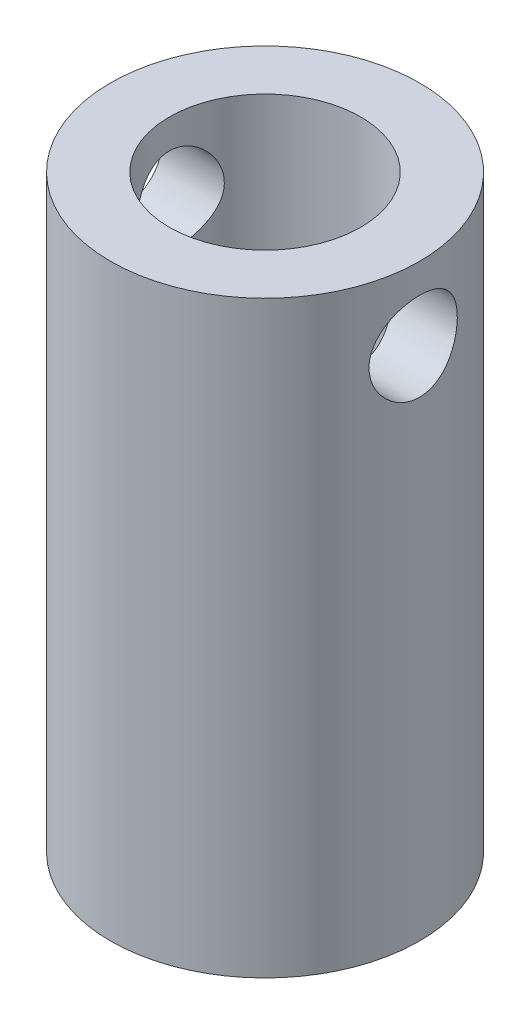
ISO-10303-21;
HEADER;
FILE_DESCRIPTION(('STEP AP214'),'2;1');
FILE_NAME('part.step','',(''),(''),'','','');
FILE_SCHEMA(('AUTOMOTIVE_DESIGN { 1 0 10303 214 1 1 1 1 }'));
ENDSEC;
DATA;
#1=APPLICATION_CONTEXT('core data for automotive mechanical design processes');
#2=APPLICATION_PROTOCOL_DEFINITION('international standard','automotive_design',2000,#1);
#3=PRODUCT_CONTEXT('',#1,'mechanical');
#4=PRODUCT('Part','Part','',(#3));
#5=PRODUCT_RELATED_PRODUCT_CATEGORY('part','',(#4));
#6=PRODUCT_DEFINITION_FORMATION('','',#4);
#7=PRODUCT_DEFINITION_CONTEXT('part definition',#1,'design');
#8=PRODUCT_DEFINITION('design','',#6,#7);
#9=PRODUCT_DEFINITION_SHAPE('','',#8);
#10=(LENGTH_UNIT() NAMED_UNIT(*) SI_UNIT(.MILLI.,.METRE.));
#11=(NAMED_UNIT(*) PLANE_ANGLE_UNIT() SI_UNIT($,.RADIAN.));
#12=(NAMED_UNIT(*) SI_UNIT($,.STERADIAN.) SOLID_ANGLE_UNIT());
#13=UNCERTAINTY_MEASURE_WITH_UNIT(LENGTH_MEASURE(1.E-05),#10,'distance_accuracy_value','');
#14=(GEOMETRIC_REPRESENTATION_CONTEXT(3) GLOBAL_UNCERTAINTY_ASSIGNED_CONTEXT((#13)) GLOBAL_UNIT_ASSIGNED_CONTEXT((#10,
#11,#12)) REPRESENTATION_CONTEXT('',''));
#15=CARTESIAN_POINT('',(0.,0.,0.));
#16=DIRECTION('',(0.,0.,1.));
#17=DIRECTION('',(1.,0.,0.));
#18=AXIS2_PLACEMENT_3D('',#15,#16,#17);
#19=CARTESIAN_POINT('',(0.,20.,0.));
#20=DIRECTION('',(0.,-1.,0.));
#21=DIRECTION('',(0.,0.,-1.));
#22=AXIS2_PLACEMENT_3D('',#19,#20,#21);
#23=CYLINDRICAL_SURFACE('',#22,5.25);
#24=CARTESIAN_POINT('',(0.,20.,0.));
#25=DIRECTION('',(0.,1.,0.));
#26=DIRECTION('',(0.,0.,1.));
#27=AXIS2_PLACEMENT_3D('',#24,#25,#26);
#28=CIRCLE('',#27,5.25);
#29=CARTESIAN_POINT('',(0.,20.,5.25));
#30=VERTEX_POINT('',#29);
#31=EDGE_CURVE('E10',#30,#30,#28,.T.);
#32=ORIENTED_EDGE('',*,*,#31,.F.);
#33=EDGE_LOOP('',(#32));
#34=FACE_BOUND('',#33,.T.);
#35=CARTESIAN_POINT('',(0.,0.,0.));
#36=DIRECTION('',(0.,1.,0.));
#37=DIRECTION('',(0.,0.,1.));
#38=AXIS2_PLACEMENT_3D('',#35,#36,#37);
#39=CIRCLE('',#38,5.25);
#40=CARTESIAN_POINT('',(0.,0.,5.25));
#41=VERTEX_POINT('',#40);
#42=EDGE_CURVE('E55',#41,#41,#39,.T.);
#43=ORIENTED_EDGE('',*,*,#42,.T.);
#44=EDGE_LOOP('',(#43));
#45=FACE_BOUND('',#44,.T.);
#46=CARTESIAN_POINT('',(-5.03115294937453,17.5,1.5));
#47=CARTESIAN_POINT('',(-5.03115410257281,17.5823886534079,1.49999851534795));
#48=CARTESIAN_POINT('',(-5.03319884759406,17.6647923131909,1.49318899949663));
#49=CARTESIAN_POINT('',(-5.04112791905326,17.8272034291472,1.46619272542646));
#50=CARTESIAN_POINT('',(-5.04701380722367,17.9072098968255,1.44600052602251));
#51=CARTESIAN_POINT('',(-5.06190532141159,18.0624529006536,1.3929700746965));
#52=CARTESIAN_POINT('',(-5.07090611443027,18.1376966138629,1.36015140488906));
#53=CARTESIAN_POINT('',(-5.09100690822109,18.2816258586658,1.28286273047203));
#54=CARTESIAN_POINT('',(-5.10210715818895,18.3503106102835,1.2383913424976));
#55=CARTESIAN_POINT('',(-5.12551337410616,18.4811436739861,1.13769360073649));
#56=CARTESIAN_POINT('',(-5.13784316973113,18.5430758515969,1.08119190834937));
#57=CARTESIAN_POINT('',(-5.16211474134014,18.6567270874778,0.958628434101953));
#58=CARTESIAN_POINT('',(-5.17405647175239,18.7084449498421,0.892565534369725));
#59=CARTESIAN_POINT('',(-5.19647499001134,18.8011214862651,0.751234524118193));
#60=CARTESIAN_POINT('',(-5.2069204087565,18.8418622148132,0.675818087821401));
#61=CARTESIAN_POINT('',(-5.22489405364148,18.910001330812,0.51885635642973));
#62=CARTESIAN_POINT('',(-5.23242284768149,18.9374023159302,0.437312258156379));
#63=CARTESIAN_POINT('',(-5.24354639475177,18.9773758459298,0.272668931340882));
#64=CARTESIAN_POINT('',(-5.24723870258477,18.9903167662785,0.189665848596779));
#65=CARTESIAN_POINT('',(-5.2506157174477,19.0021650504124,0.0225900768164428));
#66=CARTESIAN_POINT('',(-5.25030119054237,19.001075096753,-0.0614824046914111));
#67=CARTESIAN_POINT('',(-5.2457700507248,18.9851452188115,-0.225735146801415));
#68=CARTESIAN_POINT('',(-5.24166653082038,18.9707037905215,-0.305957659581709));
#69=CARTESIAN_POINT('',(-5.23015414747603,18.9291286731517,-0.462789166633213));
#70=CARTESIAN_POINT('',(-5.22274508292168,18.9019942118034,-0.539397940725381));
#71=CARTESIAN_POINT('',(-5.20529273829083,18.8355179493911,-0.687805375296693));
#72=CARTESIAN_POINT('',(-5.195221541341,18.7960459166438,-0.75954228288808));
#73=CARTESIAN_POINT('',(-5.17352076730531,18.7061165602015,-0.895505432692864));
#74=CARTESIAN_POINT('',(-5.16189084893963,18.6556568292501,-0.959730024312008));
#75=CARTESIAN_POINT('',(-5.13784262264717,18.5430957170361,-1.08122448641081));
#76=CARTESIAN_POINT('',(-5.1254109702704,18.4806479247962,-1.13817118318867));
#77=CARTESIAN_POINT('',(-5.10152230340244,18.3469636811155,-1.24086976181232));
#78=CARTESIAN_POINT('',(-5.09006536804024,18.2757265172882,-1.28662073533696));
#79=CARTESIAN_POINT('',(-5.06936381110807,18.1257018366265,-1.36592501989086));
#80=CARTESIAN_POINT('',(-5.06013758203982,18.0468585812113,-1.39937803341578));
#81=CARTESIAN_POINT('',(-5.04516408290506,17.8843351273715,-1.45244213622067));
#82=CARTESIAN_POINT('',(-5.03941580065156,17.8006563440051,-1.47205725302032));
#83=CARTESIAN_POINT('',(-5.03226836397145,17.6338896817508,-1.49630562899914));
#84=CARTESIAN_POINT('',(-5.03072783487502,17.5508786373002,-1.50142611118016));
#85=CARTESIAN_POINT('',(-5.0317811969763,17.3851837630593,-1.49789247539749));
#86=CARTESIAN_POINT('',(-5.03437457244426,17.3024998937418,-1.48924007568482));
#87=CARTESIAN_POINT('',(-5.04326572540292,17.1417690789828,-1.45883836069446));
#88=CARTESIAN_POINT('',(-5.04947732224089,17.0636593104886,-1.43739346638105));
#89=CARTESIAN_POINT('',(-5.06481797948048,16.9121485960017,-1.38236371399822));
#90=CARTESIAN_POINT('',(-5.07394746083355,16.8387483312658,-1.34877710420076));
#91=CARTESIAN_POINT('',(-5.09437641007042,16.6967334435874,-1.26946473841217));
#92=CARTESIAN_POINT('',(-5.10572398035842,16.6282821668484,-1.22345918796848));
#93=CARTESIAN_POINT('',(-5.12920294912374,16.4998927199175,-1.12095347763631));
#94=CARTESIAN_POINT('',(-5.14133451710708,16.4399563997409,-1.06445104326103));
#95=CARTESIAN_POINT('',(-5.16551045577065,16.3282154362839,-0.940281007474169));
#96=CARTESIAN_POINT('',(-5.17753804534607,16.276753771436,-0.872300782680413));
#97=CARTESIAN_POINT('',(-5.19973482784499,16.185965738963,-0.72838898029316));
#98=CARTESIAN_POINT('',(-5.20990411789059,16.1466387370582,-0.652457818573639));
#99=CARTESIAN_POINT('',(-5.22717378634804,16.0816117847303,-0.495324954717126));
#100=CARTESIAN_POINT('',(-5.23429731095436,16.0558087078104,-0.414168599924728));
#101=CARTESIAN_POINT('',(-5.24477504717914,16.0182798985449,-0.248434236412444));
#102=CARTESIAN_POINT('',(-5.24813022842264,16.006550544864,-0.163857113689079));
#103=CARTESIAN_POINT('',(-5.25064001252463,15.9977564245017,0.00313367846927154));
#104=CARTESIAN_POINT('',(-5.24993777691747,16.0001918881879,0.0855192232874674));
#105=CARTESIAN_POINT('',(-5.24474301841601,16.0184787110577,0.248658879316503));
#106=CARTESIAN_POINT('',(-5.24025067702944,16.0343294277865,0.329413068463148));
#107=CARTESIAN_POINT('',(-5.22801601395087,16.0786985207341,0.486303099779689));
#108=CARTESIAN_POINT('',(-5.22030310536131,16.107102384208,0.562473775076286));
#109=CARTESIAN_POINT('',(-5.2024282060759,16.1756696187141,0.709010402071095));
#110=CARTESIAN_POINT('',(-5.19226583626338,16.2158348103192,0.77937545293551));
#111=CARTESIAN_POINT('',(-5.17019216580141,16.3081730030686,0.914575092265432));
#112=CARTESIAN_POINT('',(-5.15823784339672,16.3606675650913,0.979182996005303));
#113=CARTESIAN_POINT('',(-5.13408048739897,16.4755818440905,1.09884091673879));
#114=CARTESIAN_POINT('',(-5.12187738590337,16.5380043033136,1.15388828414235));
#115=CARTESIAN_POINT('',(-5.09823028157902,16.6729726877466,1.25430634521844));
#116=CARTESIAN_POINT('',(-5.08681463826367,16.7457414606276,1.29938487542695));
#117=CARTESIAN_POINT('',(-5.0664633399873,16.898141398986,1.37660957714714));
#118=CARTESIAN_POINT('',(-5.05752629789876,16.9777686933163,1.40876298663645));
#119=CARTESIAN_POINT('',(-5.04418844667444,17.1307402751745,1.4557390050935));
#120=CARTESIAN_POINT('',(-5.03934329125492,17.2035177610769,1.47229424986293));
#121=CARTESIAN_POINT('',(-5.03282527099894,17.3508595887639,1.49442455282771));
#122=CARTESIAN_POINT('',(-5.03115190552542,17.4254236466733,1.5000013438736));
#123=CARTESIAN_POINT('',(-5.03115294937453,17.5,1.5));
#124=B_SPLINE_CURVE_WITH_KNOTS('',3,(#46,#47,#48,#49,#50,#51,#52,#53,#54,#55,#56,#57,#58,#59,
#60,#61,#62,#63,#64,#65,#66,#67,#68,#69,#70,#71,#72,#73,#74,#75,#76,#77,#78,#79,#80,#81,#82,#83,
#84,#85,#86,#87,#88,#89,#90,#91,#92,#93,#94,#95,#96,#97,#98,#99,#100,#101,#102,#103,#104,#105,
#106,#107,#108,#109,#110,#111,#112,#113,#114,#115,#116,#117,#118,#119,#120,#121,#122,#123),
.UNSPECIFIED.,.T.,.F.,(4,2,2,2,2,2,2,2,2,2,2,2,2,2,2,2,2,2,2,2,2,2,2,2,2,2,2,2,2,2,2,2,2,2,2,2,
2,2,4),(0.,0.246891256772964,0.493882957214146,0.740493137802325,0.987132608255508,
1.24017875404962,1.49325450928862,1.75103612260385,2.00876751763279,2.25977175771556,
2.51072800914313,2.75442778232566,2.99814238459891,3.24452177533869,3.49095519888626,
3.7460370951975,4.0011396797232,4.25827890472504,4.51534325844758,4.7636577250011,
5.01194121523837,5.25453967242384,5.49717314412031,5.74581004531786,5.99450088465078,
6.25159041282492,6.50866650063485,6.76375263973567,7.01877312807479,7.26485173263045,
7.51091855317931,7.75478559291908,7.99869040157417,8.2498482655903,8.50107562436486,
8.7589020931598,9.01658397911738,9.2400996664987,9.46358007110251),.UNSPECIFIED.);
#125=CARTESIAN_POINT('',(-5.03115294937453,17.5,1.5));
#126=VERTEX_POINT('',#125);
#127=EDGE_CURVE('E85',#126,#126,#124,.T.);
#128=ORIENTED_EDGE('',*,*,#127,.F.);
#129=EDGE_LOOP('',(#128));
#130=FACE_BOUND('',#129,.T.);
#131=CARTESIAN_POINT('',(5.03115294937453,17.5,1.5));
#132=CARTESIAN_POINT('',(5.03115410257281,17.4176113465921,1.49999851534795));
#133=CARTESIAN_POINT('',(5.03319884759406,17.3352076868091,1.49318899949663));
#134=CARTESIAN_POINT('',(5.04112791905326,17.1727965708528,1.46619272542646));
#135=CARTESIAN_POINT('',(5.04701380722367,17.0927901031745,1.44600052602251));
#136=CARTESIAN_POINT('',(5.06190532141159,16.9375470993464,1.3929700746965));
#137=CARTESIAN_POINT('',(5.07090611443027,16.8623033861372,1.36015140488906));
#138=CARTESIAN_POINT('',(5.09100690822109,16.7183741413342,1.28286273047203));
#139=CARTESIAN_POINT('',(5.10210715818895,16.6496893897165,1.2383913424976));
#140=CARTESIAN_POINT('',(5.12551337410616,16.5188563260139,1.13769360073649));
#141=CARTESIAN_POINT('',(5.13784316973113,16.4569241484031,1.08119190834937));
#142=CARTESIAN_POINT('',(5.16211474134014,16.3432729125222,0.958628434101953));
#143=CARTESIAN_POINT('',(5.17405647175239,16.2915550501579,0.892565534369725));
#144=CARTESIAN_POINT('',(5.19647499001134,16.1988785137349,0.751234524118193));
#145=CARTESIAN_POINT('',(5.2069204087565,16.1581377851868,0.675818087821401));
#146=CARTESIAN_POINT('',(5.22489405364148,16.089998669188,0.51885635642973));
#147=CARTESIAN_POINT('',(5.23242284768149,16.0625976840698,0.437312258156379));
#148=CARTESIAN_POINT('',(5.24354639475177,16.0226241540702,0.272668931340882));
#149=CARTESIAN_POINT('',(5.24723870258477,16.0096832337215,0.189665848596779));
#150=CARTESIAN_POINT('',(5.2506157174477,15.9978349495876,0.0225900768164428));
#151=CARTESIAN_POINT('',(5.25030119054237,15.998924903247,-0.0614824046914111));
#152=CARTESIAN_POINT('',(5.2457700507248,16.0148547811885,-0.225735146801415));
#153=CARTESIAN_POINT('',(5.24166653082038,16.0292962094785,-0.30595765958171));
#154=CARTESIAN_POINT('',(5.23015414747603,16.0708713268483,-0.462789166633213));
#155=CARTESIAN_POINT('',(5.22274508292168,16.0980057881966,-0.539397940725381));
#156=CARTESIAN_POINT('',(5.20529273829083,16.1644820506089,-0.687805375296692));
#157=CARTESIAN_POINT('',(5.195221541341,16.2039540833563,-0.759542282888079));
#158=CARTESIAN_POINT('',(5.17352076730531,16.2938834397985,-0.895505432692863));
#159=CARTESIAN_POINT('',(5.16189084893963,16.3443431707499,-0.959730024312007));
#160=CARTESIAN_POINT('',(5.13784262264717,16.4569042829639,-1.08122448641081));
#161=CARTESIAN_POINT('',(5.1254109702704,16.5193520752038,-1.13817118318867));
#162=CARTESIAN_POINT('',(5.10152230340244,16.6530363188845,-1.24086976181232));
#163=CARTESIAN_POINT('',(5.09006536804024,16.7242734827118,-1.28662073533696));
#164=CARTESIAN_POINT('',(5.06936381110807,16.8742981633735,-1.36592501989086));
#165=CARTESIAN_POINT('',(5.06013758203982,16.9531414187887,-1.39937803341579));
#166=CARTESIAN_POINT('',(5.04516408290506,17.1156648726285,-1.45244213622067));
#167=CARTESIAN_POINT('',(5.03941580065156,17.1993436559949,-1.47205725302032));
#168=CARTESIAN_POINT('',(5.03226836397145,17.3661103182492,-1.49630562899914));
#169=CARTESIAN_POINT('',(5.03072783487502,17.4491213626998,-1.50142611118016));
#170=CARTESIAN_POINT('',(5.0317811969763,17.6148162369407,-1.49789247539749));
#171=CARTESIAN_POINT('',(5.03437457244426,17.6975001062582,-1.48924007568482));
#172=CARTESIAN_POINT('',(5.04326572540292,17.8582309210172,-1.45883836069446));
#173=CARTESIAN_POINT('',(5.04947732224088,17.9363406895114,-1.43739346638105));
#174=CARTESIAN_POINT('',(5.06481797948048,18.0878514039983,-1.38236371399822));
#175=CARTESIAN_POINT('',(5.07394746083355,18.1612516687342,-1.34877710420076));
#176=CARTESIAN_POINT('',(5.09437641007042,18.3032665564126,-1.26946473841218));
#177=CARTESIAN_POINT('',(5.10572398035841,18.3717178331516,-1.22345918796849));
#178=CARTESIAN_POINT('',(5.12920294912373,18.5001072800825,-1.12095347763631));
#179=CARTESIAN_POINT('',(5.14133451710708,18.5600436002591,-1.06445104326103));
#180=CARTESIAN_POINT('',(5.16551045577065,18.6717845637161,-0.940281007474169));
#181=CARTESIAN_POINT('',(5.17753804534607,18.7232462285641,-0.872300782680412));
#182=CARTESIAN_POINT('',(5.19973482784499,18.8140342610371,-0.72838898029316));
#183=CARTESIAN_POINT('',(5.20990411789059,18.8533612629418,-0.652457818573639));
#184=CARTESIAN_POINT('',(5.22717378634804,18.9183882152697,-0.495324954717126));
#185=CARTESIAN_POINT('',(5.23429731095436,18.9441912921896,-0.414168599924728));
#186=CARTESIAN_POINT('',(5.24477504717914,18.9817201014551,-0.248434236412444));
#187=CARTESIAN_POINT('',(5.24813022842264,18.993449455136,-0.163857113689079));
#188=CARTESIAN_POINT('',(5.25064001252463,19.0022435754983,0.00313367846927145));
#189=CARTESIAN_POINT('',(5.24993777691747,18.9998081118121,0.0855192232874671));
#190=CARTESIAN_POINT('',(5.24474301841601,18.9815212889423,0.248658879316502));
#191=CARTESIAN_POINT('',(5.24025067702944,18.9656705722135,0.329413068463148));
#192=CARTESIAN_POINT('',(5.22801601395087,18.9213014792659,0.486303099779689));
#193=CARTESIAN_POINT('',(5.22030310536131,18.892897615792,0.562473775076285));
#194=CARTESIAN_POINT('',(5.2024282060759,18.8243303812859,0.709010402071094));
#195=CARTESIAN_POINT('',(5.19226583626338,18.7841651896808,0.77937545293551));
#196=CARTESIAN_POINT('',(5.17019216580141,18.6918269969314,0.914575092265432));
#197=CARTESIAN_POINT('',(5.15823784339672,18.6393324349087,0.979182996005303));
#198=CARTESIAN_POINT('',(5.13408048739897,18.5244181559095,1.09884091673879));
#199=CARTESIAN_POINT('',(5.12187738590337,18.4619956966864,1.15388828414235));
#200=CARTESIAN_POINT('',(5.09823028157902,18.3270273122534,1.25430634521844));
#201=CARTESIAN_POINT('',(5.08681463826367,18.2542585393724,1.29938487542695));
#202=CARTESIAN_POINT('',(5.0664633399873,18.101858601014,1.37660957714714));
#203=CARTESIAN_POINT('',(5.05752629789876,18.0222313066838,1.40876298663645));
#204=CARTESIAN_POINT('',(5.04418844667444,17.8692597248255,1.4557390050935));
#205=CARTESIAN_POINT('',(5.03934329125492,17.7964822389231,1.47229424986293));
#206=CARTESIAN_POINT('',(5.03282527099894,17.6491404112361,1.49442455282771));
#207=CARTESIAN_POINT('',(5.03115190552542,17.5745763533267,1.5000013438736));
#208=CARTESIAN_POINT('',(5.03115294937453,17.5,1.5));
#209=B_SPLINE_CURVE_WITH_KNOTS('',3,(#131,#132,#133,#134,#135,#136,#137,#138,#139,#140,#141,
#142,#143,#144,#145,#146,#147,#148,#149,#150,#151,#152,#153,#154,#155,#156,#157,#158,#159,#160,
#161,#162,#163,#164,#165,#166,#167,#168,#169,#170,#171,#172,#173,#174,#175,#176,#177,#178,#179,
#180,#181,#182,#183,#184,#185,#186,#187,#188,#189,#190,#191,#192,#193,#194,#195,#196,#197,#198,
#199,#200,#201,#202,#203,#204,#205,#206,#207,#208),.UNSPECIFIED.,.T.,.F.,(4,2,2,2,2,2,2,2,2,2,2,
2,2,2,2,2,2,2,2,2,2,2,2,2,2,2,2,2,2,2,2,2,2,2,2,2,2,2,4),(0.,0.246891256772964,
0.493882957214146,0.740493137802325,0.987132608255508,1.24017875404962,1.49325450928862,
1.75103612260385,2.00876751763279,2.25977175771556,2.51072800914313,2.75442778232566,
2.99814238459891,3.24452177533868,3.49095519888626,3.7460370951975,4.0011396797232,
4.25827890472505,4.51534325844759,4.7636577250011,5.01194121523837,5.25453967242383,
5.49717314412031,5.74581004531786,5.99450088465079,6.25159041282492,6.50866650063485,
6.76375263973567,7.01877312807479,7.26485173263045,7.51091855317931,7.75478559291908,
7.99869040157417,8.2498482655903,8.50107562436486,8.7589020931598,9.01658397911738,
9.2400996664987,9.46358007110251),.UNSPECIFIED.);
#210=CARTESIAN_POINT('',(5.03115294937453,17.5,1.5));
#211=VERTEX_POINT('',#210);
#212=EDGE_CURVE('E91',#211,#211,#209,.T.);
#213=ORIENTED_EDGE('',*,*,#212,.F.);
#214=EDGE_LOOP('',(#213));
#215=FACE_BOUND('',#214,.T.);
#216=ADVANCED_FACE('F41',(#34,#45,#130,#215),#23,.T.);
#217=CARTESIAN_POINT('',(0.,20.,0.));
#218=DIRECTION('',(0.,-1.,0.));
#219=DIRECTION('',(0.,0.,-1.));
#220=AXIS2_PLACEMENT_3D('',#217,#218,#219);
#221=CYLINDRICAL_SURFACE('',#220,3.25);
#222=CARTESIAN_POINT('',(-2.8831406486677,17.5,1.5));
#223=CARTESIAN_POINT('',(-2.8831457136264,17.5790560976274,1.49999556641992));
#224=CARTESIAN_POINT('',(-2.88644015844544,17.6582321126341,1.49370969693478));
#225=CARTESIAN_POINT('',(-2.89916399453696,17.8142248528964,1.46885414761836));
#226=CARTESIAN_POINT('',(-2.90860817570421,17.8910354217358,1.45025485263671));
#227=CARTESIAN_POINT('',(-2.9323139633626,18.0397553643252,1.40169687369929));
#228=CARTESIAN_POINT('',(-2.94655285334821,18.1116859627269,1.37179167466406));
#229=CARTESIAN_POINT('',(-2.9782090887604,18.2494914891467,1.30163233654912));
#230=CARTESIAN_POINT('',(-2.99562617608213,18.3153669082597,1.26137903774134));
#231=CARTESIAN_POINT('',(-3.03316714708755,18.4442826866733,1.16836618134815));
#232=CARTESIAN_POINT('',(-3.0533950906629,18.5068049831577,1.11493024482922));
#233=CARTESIAN_POINT('',(-3.09343234273965,18.6223938096352,0.998482280785272));
#234=CARTESIAN_POINT('',(-3.11324146363631,18.6754561781191,0.935466061279191));
#235=CARTESIAN_POINT('',(-3.15152392195906,18.7734806432329,0.797372263715595));
#236=CARTESIAN_POINT('',(-3.16986256926451,18.8178315620688,0.721820051078077));
#237=CARTESIAN_POINT('',(-3.20182516260171,18.8929625183494,0.56332409092034));
#238=CARTESIAN_POINT('',(-3.21545165364737,18.9237498838764,0.480384363900044));
#239=CARTESIAN_POINT('',(-3.23571086174561,18.9689131696823,0.314933648113405));
#240=CARTESIAN_POINT('',(-3.24272563710553,18.9841902107523,0.232716432643605));
#241=CARTESIAN_POINT('',(-3.25037878818967,19.0008399521561,0.0666076979909081));
#242=CARTESIAN_POINT('',(-3.25102038740195,19.0022196816145,-0.0172829532677168));
#243=CARTESIAN_POINT('',(-3.2460575180355,18.9914440101853,-0.177691624209255));
#244=CARTESIAN_POINT('',(-3.24091400620298,18.9802875539496,-0.254293968157488));
#245=CARTESIAN_POINT('',(-3.22562512287074,18.946507332497,-0.404395406998727));
#246=CARTESIAN_POINT('',(-3.21547938016454,18.9238827162453,-0.477894271148611));
#247=CARTESIAN_POINT('',(-3.19094774192041,18.8675879627256,-0.621056530120167));
#248=CARTESIAN_POINT('',(-3.17650045920505,18.8337570549195,-0.69064575176384));
#249=CARTESIAN_POINT('',(-3.14472149367112,18.7561940983343,-0.823340056563827));
#250=CARTESIAN_POINT('',(-3.12738875365795,18.7124584184491,-0.88644274938207));
#251=CARTESIAN_POINT('',(-3.08981116071687,18.6121036124907,-1.00998865129199));
#252=CARTESIAN_POINT('',(-3.06944399350116,18.554713296358,-1.0697689773231));
#253=CARTESIAN_POINT('',(-3.02909824323476,18.4307885054979,-1.17918246727279));
#254=CARTESIAN_POINT('',(-3.00911988962755,18.3642488078596,-1.22880979481939));
#255=CARTESIAN_POINT('',(-2.970824723522,18.2199693721501,-1.31879065623883));
#256=CARTESIAN_POINT('',(-2.95263289679021,18.1418464175384,-1.35858783900658));
#257=CARTESIAN_POINT('',(-2.92156472084363,17.9789558373972,-1.42418098595598));
#258=CARTESIAN_POINT('',(-2.90868360135206,17.8941942567414,-1.44998952185268));
#259=CARTESIAN_POINT('',(-2.89096621176897,17.7270781546771,-1.48498298275772));
#260=CARTESIAN_POINT('',(-2.8856059064814,17.645008433775,-1.49525517003752));
#261=CARTESIAN_POINT('',(-2.88203375109532,17.4801603860731,-1.50213248837152));
#262=CARTESIAN_POINT('',(-2.88381831630823,17.3973824354001,-1.49874447294808));
#263=CARTESIAN_POINT('',(-2.89378448222421,17.2410386814997,-1.47939407855597));
#264=CARTESIAN_POINT('',(-2.90140090883,17.1672942375511,-1.46454174491479));
#265=CARTESIAN_POINT('',(-2.9213910014952,17.0234433641447,-1.42424595450329));
#266=CARTESIAN_POINT('',(-2.9337659665515,16.9533379340097,-1.39879960559706));
#267=CARTESIAN_POINT('',(-2.96255754699623,16.8151423135286,-1.33677544030458));
#268=CARTESIAN_POINT('',(-2.97913318602949,16.7472911125863,-1.29974156041788));
#269=CARTESIAN_POINT('',(-3.014277203004,16.6183992171179,-1.21601516610396));
#270=CARTESIAN_POINT('',(-3.03284655353677,16.5573618764808,-1.16931792720833));
#271=CARTESIAN_POINT('',(-3.07221170888887,16.4372033803787,-1.0618912571298));
#272=CARTESIAN_POINT('',(-3.09303821543065,16.3789417186653,-1.00020754623496));
#273=CARTESIAN_POINT('',(-3.13284209138054,16.2733816437552,-0.867522200075313));
#274=CARTESIAN_POINT('',(-3.15181910370929,16.2260853452055,-0.796518771650643));
#275=CARTESIAN_POINT('',(-3.18614398952109,16.143367851735,-0.645779611223706));
#276=CARTESIAN_POINT('',(-3.20144088338452,16.1081109132288,-0.565941369277084));
#277=CARTESIAN_POINT('',(-3.22630112308052,16.051842029127,-0.400564052656327));
#278=CARTESIAN_POINT('',(-3.23586873719673,16.030819477457,-0.315029274796206));
#279=CARTESIAN_POINT('',(-3.24760255095982,16.0051627330869,-0.14827416267167));
#280=CARTESIAN_POINT('',(-3.25031216242763,15.9993242123861,-0.0672765616788379));
#281=CARTESIAN_POINT('',(-3.24963056758422,16.0007998747583,0.0945622690764497));
#282=CARTESIAN_POINT('',(-3.24624091728073,16.0081107032464,0.175403533455668));
#283=CARTESIAN_POINT('',(-3.2340523596831,16.034829638553,0.330377110165539));
#284=CARTESIAN_POINT('',(-3.22553506572324,16.053608631583,0.404642109320069));
#285=CARTESIAN_POINT('',(-3.20414398077751,16.1019630180539,0.548892033085126));
#286=CARTESIAN_POINT('',(-3.19126946858673,16.13154019887,0.618876246876173));
#287=CARTESIAN_POINT('',(-3.16163485368075,16.202114872714,0.756120738614402));
#288=CARTESIAN_POINT('',(-3.14472447718235,16.2435711851636,0.823111747237912));
#289=CARTESIAN_POINT('',(-3.10890779784662,16.3361154819643,0.949480528445798));
#290=CARTESIAN_POINT('',(-3.09000060866342,16.387207751501,1.00885489403557));
#291=CARTESIAN_POINT('',(-3.05024317409845,16.5026706194358,1.12361573961565));
#292=CARTESIAN_POINT('',(-3.02936483348882,16.5678023810008,1.17822919208649));
#293=CARTESIAN_POINT('',(-2.98952045702795,16.7068048729978,1.27595496376296));
#294=CARTESIAN_POINT('',(-2.9705557395262,16.7806815529301,1.31905938727254));
#295=CARTESIAN_POINT('',(-2.9367233715017,16.9363737727927,1.39277649849144));
#296=CARTESIAN_POINT('',(-2.92190329259102,17.0182679933934,1.42324593883137));
#297=CARTESIAN_POINT('',(-2.8989091900939,17.1868368014213,1.4695281449198));
#298=CARTESIAN_POINT('',(-2.89071286577159,17.2734942904179,1.48539011621649));
#299=CARTESIAN_POINT('',(-2.88537886682204,17.3840085737252,1.49569022737934));
#300=CARTESIAN_POINT('',(-2.88454161144604,17.4071659912239,1.49730457328771));
#301=CARTESIAN_POINT('',(-2.88342174659474,17.4535454853103,1.49946013339421));
#302=CARTESIAN_POINT('',(-2.88313916021419,17.47676756455,1.50000130290852));
#303=CARTESIAN_POINT('',(-2.8831406486677,17.5,1.5));
#304=B_SPLINE_CURVE_WITH_KNOTS('',3,(#222,#223,#224,#225,#226,#227,#228,#229,#230,#231,#232,
#233,#234,#235,#236,#237,#238,#239,#240,#241,#242,#243,#244,#245,#246,#247,#248,#249,#250,#251,
#252,#253,#254,#255,#256,#257,#258,#259,#260,#261,#262,#263,#264,#265,#266,#267,#268,#269,#270,
#271,#272,#273,#274,#275,#276,#277,#278,#279,#280,#281,#282,#283,#284,#285,#286,#287,#288,#289,
#290,#291,#292,#293,#294,#295,#296,#297,#298,#299,#300,#301,#302,#303),.UNSPECIFIED.,.T.,.F.,(4,
2,2,2,2,2,2,2,2,2,2,2,2,2,2,2,2,2,2,2,2,2,2,2,2,2,2,2,2,2,2,2,2,2,2,2,2,2,2,2,4),(0.,
0.237070629842366,0.474713522307298,0.711245984859908,0.947759246897386,1.20076595244837,
1.45388368480718,1.72101627750577,1.98800436695451,2.23839767342451,2.48866432703864,
2.72031924760969,2.95199136146053,3.18714254087517,3.42238006705796,3.67727504444584,
3.93231613705002,4.19954224888931,4.46652780247584,4.71378889158367,4.96092594164794,
5.1867417340035,5.41261921389103,5.64883211936518,5.88516078461181,6.14606812623411,
6.40702574151083,6.67141336219644,6.93560376963524,7.1780930271259,7.42052043095548,
7.65071362192283,7.88094493301842,8.1216630431116,8.36248845593739,8.62387073294537,
8.88543187151773,9.14988229823359,9.41343862478239,9.48310433001486,9.5527729358556),.UNSPECIFIED.);
#305=CARTESIAN_POINT('',(-2.8831406486677,17.5,1.5));
#306=VERTEX_POINT('',#305);
#307=EDGE_CURVE('E66',#306,#306,#304,.T.);
#308=ORIENTED_EDGE('',*,*,#307,.T.);
#309=EDGE_LOOP('',(#308));
#310=FACE_BOUND('',#309,.T.);
#311=CARTESIAN_POINT('',(0.,20.,0.));
#312=DIRECTION('',(0.,1.,0.));
#313=DIRECTION('',(0.,0.,1.));
#314=AXIS2_PLACEMENT_3D('',#311,#312,#313);
#315=CIRCLE('',#314,3.25);
#316=CARTESIAN_POINT('',(0.,20.,3.25));
#317=VERTEX_POINT('',#316);
#318=EDGE_CURVE('E61',#317,#317,#315,.T.);
#319=ORIENTED_EDGE('',*,*,#318,.T.);
#320=EDGE_LOOP('',(#319));
#321=FACE_BOUND('',#320,.T.);
#322=CARTESIAN_POINT('',(0.,0.,0.));
#323=DIRECTION('',(0.,1.,0.));
#324=DIRECTION('',(0.,0.,1.));
#325=AXIS2_PLACEMENT_3D('',#322,#323,#324);
#326=CIRCLE('',#325,3.25);
#327=CARTESIAN_POINT('',(0.,0.,3.25));
#328=VERTEX_POINT('',#327);
#329=EDGE_CURVE('E64',#328,#328,#326,.T.);
#330=ORIENTED_EDGE('',*,*,#329,.F.);
#331=EDGE_LOOP('',(#330));
#332=FACE_BOUND('',#331,.T.);
#333=CARTESIAN_POINT('',(2.8831406486677,17.5,1.5));
#334=CARTESIAN_POINT('',(2.8831457136264,17.4209439023726,1.49999556641992));
#335=CARTESIAN_POINT('',(2.88644015844544,17.3417678873659,1.49370969693478));
#336=CARTESIAN_POINT('',(2.89916399453696,17.1857751471036,1.46885414761836));
#337=CARTESIAN_POINT('',(2.90860817570421,17.1089645782642,1.45025485263671));
#338=CARTESIAN_POINT('',(2.9323139633626,16.9602446356748,1.40169687369929));
#339=CARTESIAN_POINT('',(2.94655285334821,16.8883140372731,1.37179167466406));
#340=CARTESIAN_POINT('',(2.9782090887604,16.7505085108533,1.30163233654912));
#341=CARTESIAN_POINT('',(2.99562617608213,16.6846330917403,1.26137903774134));
#342=CARTESIAN_POINT('',(3.03316714708755,16.5557173133267,1.16836618134815));
#343=CARTESIAN_POINT('',(3.0533950906629,16.4931950168423,1.11493024482922));
#344=CARTESIAN_POINT('',(3.09343234273965,16.3776061903648,0.998482280785272));
#345=CARTESIAN_POINT('',(3.11324146363631,16.3245438218809,0.935466061279191));
#346=CARTESIAN_POINT('',(3.15152392195906,16.2265193567671,0.797372263715595));
#347=CARTESIAN_POINT('',(3.16986256926451,16.1821684379312,0.721820051078077));
#348=CARTESIAN_POINT('',(3.20182516260171,16.1070374816506,0.56332409092034));
#349=CARTESIAN_POINT('',(3.21545165364737,16.0762501161236,0.480384363900044));
#350=CARTESIAN_POINT('',(3.23571086174561,16.0310868303177,0.314933648113405));
#351=CARTESIAN_POINT('',(3.24272563710553,16.0158097892477,0.232716432643605));
#352=CARTESIAN_POINT('',(3.25037878818967,15.9991600478439,0.0666076979909081));
#353=CARTESIAN_POINT('',(3.25102038740195,15.9977803183855,-0.0172829532677168));
#354=CARTESIAN_POINT('',(3.2460575180355,16.0085559898147,-0.177691624209255));
#355=CARTESIAN_POINT('',(3.24091400620298,16.0197124460504,-0.254293968157487));
#356=CARTESIAN_POINT('',(3.22562512287075,16.053492667503,-0.404395406998727));
#357=CARTESIAN_POINT('',(3.21547938016454,16.0761172837547,-0.477894271148611));
#358=CARTESIAN_POINT('',(3.19094774192041,16.1324120372744,-0.621056530120167));
#359=CARTESIAN_POINT('',(3.17650045920505,16.1662429450805,-0.69064575176384));
#360=CARTESIAN_POINT('',(3.14472149367112,16.2438059016657,-0.823340056563827));
#361=CARTESIAN_POINT('',(3.12738875365795,16.2875415815509,-0.88644274938207));
#362=CARTESIAN_POINT('',(3.08981116071687,16.3878963875093,-1.00998865129199));
#363=CARTESIAN_POINT('',(3.06944399350116,16.445286703642,-1.0697689773231));
#364=CARTESIAN_POINT('',(3.02909824323476,16.5692114945021,-1.17918246727279));
#365=CARTESIAN_POINT('',(3.00911988962755,16.6357511921404,-1.22880979481939));
#366=CARTESIAN_POINT('',(2.970824723522,16.7800306278499,-1.31879065623883));
#367=CARTESIAN_POINT('',(2.95263289679021,16.8581535824616,-1.35858783900658));
#368=CARTESIAN_POINT('',(2.92156472084363,17.0210441626028,-1.42418098595598));
#369=CARTESIAN_POINT('',(2.90868360135206,17.1058057432586,-1.44998952185268));
#370=CARTESIAN_POINT('',(2.89096621176897,17.2729218453229,-1.48498298275772));
#371=CARTESIAN_POINT('',(2.8856059064814,17.354991566225,-1.49525517003752));
#372=CARTESIAN_POINT('',(2.88203375109532,17.5198396139269,-1.50213248837152));
#373=CARTESIAN_POINT('',(2.88381831630823,17.6026175645999,-1.49874447294808));
#374=CARTESIAN_POINT('',(2.89378448222421,17.7589613185003,-1.47939407855597));
#375=CARTESIAN_POINT('',(2.90140090883,17.8327057624489,-1.46454174491479));
#376=CARTESIAN_POINT('',(2.9213910014952,17.9765566358553,-1.42424595450329));
#377=CARTESIAN_POINT('',(2.9337659665515,18.0466620659903,-1.39879960559706));
#378=CARTESIAN_POINT('',(2.96255754699623,18.1848576864714,-1.33677544030458));
#379=CARTESIAN_POINT('',(2.97913318602949,18.2527088874137,-1.29974156041788));
#380=CARTESIAN_POINT('',(3.014277203004,18.3816007828821,-1.21601516610396));
#381=CARTESIAN_POINT('',(3.03284655353677,18.4426381235192,-1.16931792720833));
#382=CARTESIAN_POINT('',(3.07221170888887,18.5627966196213,-1.0618912571298));
#383=CARTESIAN_POINT('',(3.09303821543065,18.6210582813347,-1.00020754623496));
#384=CARTESIAN_POINT('',(3.13284209138054,18.7266183562448,-0.867522200075313));
#385=CARTESIAN_POINT('',(3.15181910370929,18.7739146547945,-0.796518771650643));
#386=CARTESIAN_POINT('',(3.18614398952109,18.856632148265,-0.645779611223706));
#387=CARTESIAN_POINT('',(3.20144088338452,18.8918890867712,-0.565941369277084));
#388=CARTESIAN_POINT('',(3.22630112308052,18.948157970873,-0.400564052656327));
#389=CARTESIAN_POINT('',(3.23586873719673,18.969180522543,-0.315029274796206));
#390=CARTESIAN_POINT('',(3.24760255095982,18.9948372669131,-0.14827416267167));
#391=CARTESIAN_POINT('',(3.25031216242763,19.0006757876139,-0.067276561678838));
#392=CARTESIAN_POINT('',(3.24963056758422,18.9992001252418,0.0945622690764497));
#393=CARTESIAN_POINT('',(3.24624091728073,18.9918892967536,0.175403533455668));
#394=CARTESIAN_POINT('',(3.2340523596831,18.9651703614471,0.330377110165539));
#395=CARTESIAN_POINT('',(3.22553506572324,18.946391368417,0.404642109320069));
#396=CARTESIAN_POINT('',(3.20414398077751,18.8980369819461,0.548892033085126));
#397=CARTESIAN_POINT('',(3.19126946858673,18.86845980113,0.618876246876173));
#398=CARTESIAN_POINT('',(3.16163485368075,18.797885127286,0.756120738614403));
#399=CARTESIAN_POINT('',(3.14472447718235,18.7564288148364,0.823111747237914));
#400=CARTESIAN_POINT('',(3.10890779784662,18.6638845180357,0.9494805284458));
#401=CARTESIAN_POINT('',(3.09000060866342,18.612792248499,1.00885489403557));
#402=CARTESIAN_POINT('',(3.05024317409845,18.4973293805642,1.12361573961565));
#403=CARTESIAN_POINT('',(3.02936483348882,18.4321976189992,1.17822919208649));
#404=CARTESIAN_POINT('',(2.98952045702795,18.2931951270022,1.27595496376296));
#405=CARTESIAN_POINT('',(2.9705557395262,18.2193184470699,1.31905938727254));
#406=CARTESIAN_POINT('',(2.9367233715017,18.0636262272073,1.39277649849144));
#407=CARTESIAN_POINT('',(2.92190329259102,17.9817320066066,1.42324593883137));
#408=CARTESIAN_POINT('',(2.8989091900939,17.8131631985787,1.4695281449198));
#409=CARTESIAN_POINT('',(2.89071286577159,17.7265057095821,1.48539011621649));
#410=CARTESIAN_POINT('',(2.88537886682204,17.6159914262748,1.49569022737934));
#411=CARTESIAN_POINT('',(2.88454161144604,17.5928340087761,1.49730457328771));
#412=CARTESIAN_POINT('',(2.88342174659474,17.5464545146897,1.49946013339421));
#413=CARTESIAN_POINT('',(2.88313916021419,17.52323243545,1.50000130290852));
#414=CARTESIAN_POINT('',(2.8831406486677,17.5,1.5));
#415=B_SPLINE_CURVE_WITH_KNOTS('',3,(#333,#334,#335,#336,#337,#338,#339,#340,#341,#342,#343,
#344,#345,#346,#347,#348,#349,#350,#351,#352,#353,#354,#355,#356,#357,#358,#359,#360,#361,#362,
#363,#364,#365,#366,#367,#368,#369,#370,#371,#372,#373,#374,#375,#376,#377,#378,#379,#380,#381,
#382,#383,#384,#385,#386,#387,#388,#389,#390,#391,#392,#393,#394,#395,#396,#397,#398,#399,#400,
#401,#402,#403,#404,#405,#406,#407,#408,#409,#410,#411,#412,#413,#414),.UNSPECIFIED.,.T.,.F.,(4,
2,2,2,2,2,2,2,2,2,2,2,2,2,2,2,2,2,2,2,2,2,2,2,2,2,2,2,2,2,2,2,2,2,2,2,2,2,2,2,4),(0.,
0.237070629842366,0.474713522307298,0.711245984859916,0.947759246897386,1.20076595244837,
1.45388368480718,1.72101627750577,1.98800436695452,2.23839767342451,2.48866432703864,
2.72031924760969,2.95199136146053,3.18714254087517,3.42238006705796,3.67727504444584,
3.93231613705002,4.19954224888931,4.46652780247584,4.71378889158367,4.96092594164794,
5.1867417340035,5.41261921389103,5.64883211936518,5.88516078461181,6.14606812623411,
6.40702574151083,6.67141336219644,6.93560376963524,7.1780930271259,7.42052043095548,
7.65071362192283,7.88094493301842,8.12166304311161,8.36248845593739,8.62387073294537,
8.88543187151773,9.14988229823359,9.41343862478238,9.48310433001486,9.5527729358556),.UNSPECIFIED.);
#416=CARTESIAN_POINT('',(2.8831406486677,17.5,1.5));
#417=VERTEX_POINT('',#416);
#418=EDGE_CURVE('E45',#417,#417,#415,.T.);
#419=ORIENTED_EDGE('',*,*,#418,.T.);
#420=EDGE_LOOP('',(#419));
#421=FACE_BOUND('',#420,.T.);
#422=ADVANCED_FACE('F72',(#310,#321,#332,#421),#221,.F.);
#423=CARTESIAN_POINT('',(0.,20.,0.));
#424=DIRECTION('',(0.,1.,0.));
#425=DIRECTION('',(0.,0.,1.));
#426=AXIS2_PLACEMENT_3D('',#423,#424,#425);
#427=PLANE('',#426);
#428=ORIENTED_EDGE('',*,*,#31,.T.);
#429=EDGE_LOOP('',(#428));
#430=FACE_BOUND('',#429,.T.);
#431=ORIENTED_EDGE('',*,*,#318,.F.);
#432=EDGE_LOOP('',(#431));
#433=FACE_BOUND('',#432,.T.);
#434=ADVANCED_FACE('F109',(#430,#433),#427,.T.);
#435=CARTESIAN_POINT('',(0.,0.,0.));
#436=DIRECTION('',(0.,1.,0.));
#437=DIRECTION('',(0.,0.,1.));
#438=AXIS2_PLACEMENT_3D('',#435,#436,#437);
#439=PLANE('',#438);
#440=ORIENTED_EDGE('',*,*,#42,.F.);
#441=EDGE_LOOP('',(#440));
#442=FACE_BOUND('',#441,.T.);
#443=ORIENTED_EDGE('',*,*,#329,.T.);
#444=EDGE_LOOP('',(#443));
#445=FACE_BOUND('',#444,.T.);
#446=ADVANCED_FACE('F105',(#442,#445),#439,.F.);
#447=CARTESIAN_POINT('',(20.,17.5,0.));
#448=DIRECTION('',(-1.,0.,0.));
#449=DIRECTION('',(0.,0.,1.));
#450=AXIS2_PLACEMENT_3D('',#447,#448,#449);
#451=CYLINDRICAL_SURFACE('',#450,1.5);
#452=ORIENTED_EDGE('',*,*,#307,.F.);
#453=EDGE_LOOP('',(#452));
#454=FACE_BOUND('',#453,.T.);
#455=ORIENTED_EDGE('',*,*,#127,.T.);
#456=EDGE_LOOP('',(#455));
#457=FACE_BOUND('',#456,.T.);
#458=ADVANCED_FACE('F78',(#454,#457),#451,.F.);
#459=ORIENTED_EDGE('',*,*,#418,.F.);
#460=EDGE_LOOP('',(#459));
#461=FACE_BOUND('',#460,.T.);
#462=ORIENTED_EDGE('',*,*,#212,.T.);
#463=EDGE_LOOP('',(#462));
#464=FACE_BOUND('',#463,.T.);
#465=ADVANCED_FACE('F75',(#461,#464),#451,.F.);
#466=CLOSED_SHELL('',(#216,#422,#434,#446,#458,#465));
#467=MANIFOLD_SOLID_BREP('B2',#466);
#468=ADVANCED_BREP_SHAPE_REPRESENTATION('',(#18,#467),#14);
#469=SHAPE_DEFINITION_REPRESENTATION(#9,#468);
ENDSEC;
END-ISO-10303-21;
